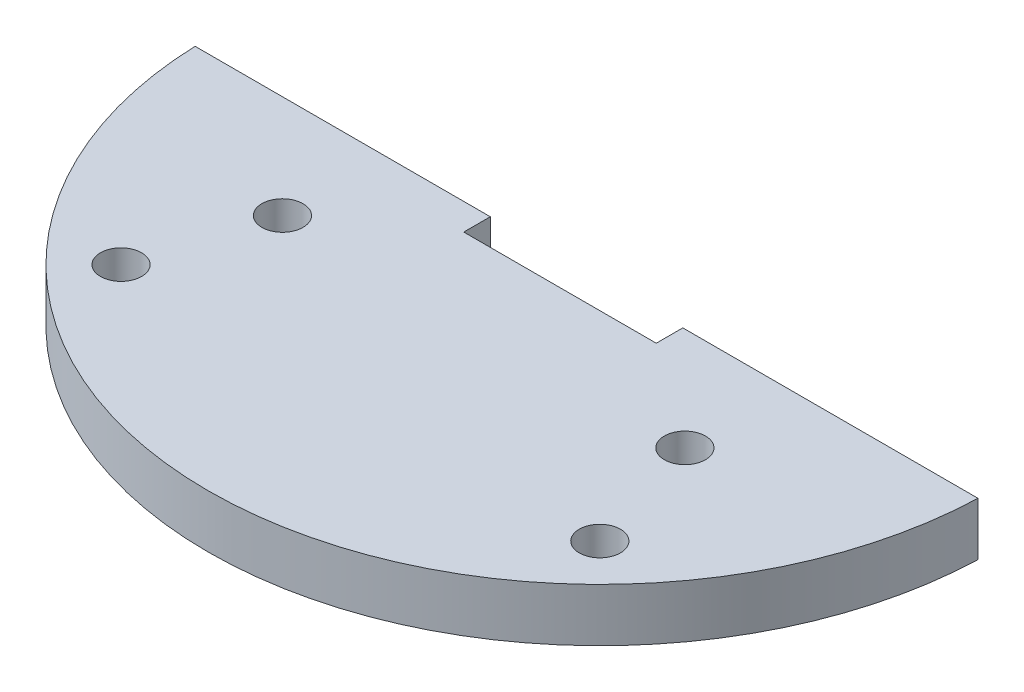
ISO-10303-21;
HEADER;
FILE_DESCRIPTION(('STEP AP214'),'2;1');
FILE_NAME('part.step','',(''),(''),'','','');
FILE_SCHEMA(('AUTOMOTIVE_DESIGN { 1 0 10303 214 1 1 1 1 }'));
ENDSEC;
DATA;
#1=APPLICATION_CONTEXT('core data for automotive mechanical design processes');
#2=APPLICATION_PROTOCOL_DEFINITION('international standard','automotive_design',2000,#1);
#3=PRODUCT_CONTEXT('',#1,'mechanical');
#4=PRODUCT('Part','Part','',(#3));
#5=PRODUCT_RELATED_PRODUCT_CATEGORY('part','',(#4));
#6=PRODUCT_DEFINITION_FORMATION('','',#4);
#7=PRODUCT_DEFINITION_CONTEXT('part definition',#1,'design');
#8=PRODUCT_DEFINITION('design','',#6,#7);
#9=PRODUCT_DEFINITION_SHAPE('','',#8);
#10=(LENGTH_UNIT() NAMED_UNIT(*) SI_UNIT(.MILLI.,.METRE.));
#11=(NAMED_UNIT(*) PLANE_ANGLE_UNIT() SI_UNIT($,.RADIAN.));
#12=(NAMED_UNIT(*) SI_UNIT($,.STERADIAN.) SOLID_ANGLE_UNIT());
#13=UNCERTAINTY_MEASURE_WITH_UNIT(LENGTH_MEASURE(1.E-05),#10,'distance_accuracy_value','');
#14=(GEOMETRIC_REPRESENTATION_CONTEXT(3) GLOBAL_UNCERTAINTY_ASSIGNED_CONTEXT((#13)) GLOBAL_UNIT_ASSIGNED_CONTEXT((#10,
#11,#12)) REPRESENTATION_CONTEXT('',''));
#15=CARTESIAN_POINT('',(0.,0.,0.));
#16=DIRECTION('',(0.,0.,1.));
#17=DIRECTION('',(1.,0.,0.));
#18=AXIS2_PLACEMENT_3D('',#15,#16,#17);
#19=CARTESIAN_POINT('',(-30.66172047433,-0.01,1.));
#20=DIRECTION('',(0.,0.,1.));
#21=DIRECTION('',(1.,0.,0.));
#22=AXIS2_PLACEMENT_3D('',#19,#20,#21);
#23=PLANE('',#22);
#24=DIRECTION('',(1.,0.,0.));
#25=VECTOR('',#24,1.);
#26=CARTESIAN_POINT('',(0.,4.,1.));
#27=LINE('',#26,#25);
#28=CARTESIAN_POINT('',(-29.4830459756111,4.,1.));
#29=VERTEX_POINT('',#28);
#30=CARTESIAN_POINT('',(-7.25,4.,1.));
#31=VERTEX_POINT('',#30);
#32=EDGE_CURVE('E150',#29,#31,#27,.T.);
#33=ORIENTED_EDGE('',*,*,#32,.T.);
#34=DIRECTION('',(0.,1.,0.));
#35=VECTOR('',#34,1.);
#36=CARTESIAN_POINT('',(-7.25,0.,1.));
#37=LINE('',#36,#35);
#38=CARTESIAN_POINT('',(-7.25,0.,1.));
#39=VERTEX_POINT('',#38);
#40=EDGE_CURVE('E128',#39,#31,#37,.T.);
#41=ORIENTED_EDGE('',*,*,#40,.F.);
#42=DIRECTION('',(1.,0.,0.));
#43=VECTOR('',#42,1.);
#44=CARTESIAN_POINT('',(0.,0.,1.));
#45=LINE('',#44,#43);
#46=CARTESIAN_POINT('',(-29.4830459756111,0.,1.));
#47=VERTEX_POINT('',#46);
#48=EDGE_CURVE('E114',#47,#39,#45,.T.);
#49=ORIENTED_EDGE('',*,*,#48,.F.);
#50=DIRECTION('',(0.,-1.,0.));
#51=VECTOR('',#50,1.);
#52=CARTESIAN_POINT('',(-29.4830459756111,4.,1.));
#53=LINE('',#52,#51);
#54=EDGE_CURVE('E40',#29,#47,#53,.T.);
#55=ORIENTED_EDGE('',*,*,#54,.F.);
#56=EDGE_LOOP('',(#33,#41,#49,#55));
#57=FACE_BOUND('',#56,.T.);
#58=ADVANCED_FACE('F37',(#57),#23,.F.);
#59=CARTESIAN_POINT('',(7.25,0.,1.));
#60=VERTEX_POINT('',#59);
#61=CARTESIAN_POINT('',(29.4830459756111,0.,1.));
#62=VERTEX_POINT('',#61);
#63=EDGE_CURVE('E146',#60,#62,#45,.T.);
#64=ORIENTED_EDGE('',*,*,#63,.F.);
#65=DIRECTION('',(0.,1.,0.));
#66=VECTOR('',#65,1.);
#67=CARTESIAN_POINT('',(7.25,0.,1.));
#68=LINE('',#67,#66);
#69=CARTESIAN_POINT('',(7.25,4.,1.));
#70=VERTEX_POINT('',#69);
#71=EDGE_CURVE('E11',#60,#70,#68,.T.);
#72=ORIENTED_EDGE('',*,*,#71,.T.);
#73=CARTESIAN_POINT('',(29.4830459756111,4.,1.));
#74=VERTEX_POINT('',#73);
#75=EDGE_CURVE('E45',#70,#74,#27,.T.);
#76=ORIENTED_EDGE('',*,*,#75,.T.);
#77=DIRECTION('',(0.,-1.,0.));
#78=VECTOR('',#77,1.);
#79=CARTESIAN_POINT('',(29.4830459756111,4.,1.));
#80=LINE('',#79,#78);
#81=EDGE_CURVE('E151',#62,#74,#80,.F.);
#82=ORIENTED_EDGE('',*,*,#81,.F.);
#83=EDGE_LOOP('',(#64,#72,#76,#82));
#84=FACE_BOUND('',#83,.T.);
#85=ADVANCED_FACE('F178',(#84),#23,.F.);
#86=CARTESIAN_POINT('',(18.031222920257,0.,18.0312229202569));
#87=DIRECTION('',(0.,1.,0.));
#88=DIRECTION('',(0.,0.,1.));
#89=AXIS2_PLACEMENT_3D('',#86,#87,#88);
#90=CYLINDRICAL_SURFACE('',#89,1.55);
#91=CARTESIAN_POINT('',(18.031222920257,0.,18.0312229202569));
#92=DIRECTION('',(0.,1.,0.));
#93=DIRECTION('',(0.,0.,-1.));
#94=AXIS2_PLACEMENT_3D('',#91,#92,#93);
#95=CIRCLE('',#94,1.55);
#96=CARTESIAN_POINT('',(18.031222920257,0.,16.4812229202569));
#97=VERTEX_POINT('',#96);
#98=EDGE_CURVE('E139',#97,#97,#95,.T.);
#99=ORIENTED_EDGE('',*,*,#98,.F.);
#100=EDGE_LOOP('',(#99));
#101=FACE_BOUND('',#100,.T.);
#102=CARTESIAN_POINT('',(18.031222920257,4.,18.0312229202569));
#103=DIRECTION('',(0.,1.,0.));
#104=DIRECTION('',(0.,0.,-1.));
#105=AXIS2_PLACEMENT_3D('',#102,#103,#104);
#106=CIRCLE('',#105,1.55);
#107=CARTESIAN_POINT('',(18.031222920257,4.,16.4812229202569));
#108=VERTEX_POINT('',#107);
#109=EDGE_CURVE('E129',#108,#108,#106,.T.);
#110=ORIENTED_EDGE('',*,*,#109,.T.);
#111=EDGE_LOOP('',(#110));
#112=FACE_BOUND('',#111,.T.);
#113=ADVANCED_FACE('F173',(#101,#112),#90,.F.);
#114=CARTESIAN_POINT('',(-18.0312229202569,0.,18.0312229202571));
#115=DIRECTION('',(0.,1.,0.));
#116=DIRECTION('',(0.,0.,1.));
#117=AXIS2_PLACEMENT_3D('',#114,#115,#116);
#118=CYLINDRICAL_SURFACE('',#117,1.55);
#119=CARTESIAN_POINT('',(-18.0312229202569,0.,18.0312229202571));
#120=DIRECTION('',(0.,1.,0.));
#121=DIRECTION('',(1.,0.,0.));
#122=AXIS2_PLACEMENT_3D('',#119,#120,#121);
#123=CIRCLE('',#122,1.55);
#124=CARTESIAN_POINT('',(-16.4812229202569,0.,18.0312229202571));
#125=VERTEX_POINT('',#124);
#126=EDGE_CURVE('E132',#125,#125,#123,.T.);
#127=ORIENTED_EDGE('',*,*,#126,.F.);
#128=EDGE_LOOP('',(#127));
#129=FACE_BOUND('',#128,.T.);
#130=CARTESIAN_POINT('',(-18.0312229202569,4.,18.0312229202571));
#131=DIRECTION('',(0.,1.,0.));
#132=DIRECTION('',(1.,0.,0.));
#133=AXIS2_PLACEMENT_3D('',#130,#131,#132);
#134=CIRCLE('',#133,1.55);
#135=CARTESIAN_POINT('',(-16.4812229202569,4.,18.0312229202571));
#136=VERTEX_POINT('',#135);
#137=EDGE_CURVE('E136',#136,#136,#134,.T.);
#138=ORIENTED_EDGE('',*,*,#137,.T.);
#139=EDGE_LOOP('',(#138));
#140=FACE_BOUND('',#139,.T.);
#141=ADVANCED_FACE('F165',(#129,#140),#118,.F.);
#142=CARTESIAN_POINT('',(0.,4.,0.));
#143=DIRECTION('',(0.,-1.,0.));
#144=DIRECTION('',(0.,0.,-1.));
#145=AXIS2_PLACEMENT_3D('',#142,#143,#144);
#146=CYLINDRICAL_SURFACE('',#145,29.5);
#147=CARTESIAN_POINT('',(0.,4.,0.));
#148=DIRECTION('',(0.,1.,0.));
#149=DIRECTION('',(0.,0.,1.));
#150=AXIS2_PLACEMENT_3D('',#147,#148,#149);
#151=CIRCLE('',#150,29.5);
#152=EDGE_CURVE('E144',#29,#74,#151,.T.);
#153=ORIENTED_EDGE('',*,*,#152,.F.);
#154=ORIENTED_EDGE('',*,*,#54,.T.);
#155=CARTESIAN_POINT('',(0.,0.,0.));
#156=DIRECTION('',(0.,1.,0.));
#157=DIRECTION('',(0.,0.,1.));
#158=AXIS2_PLACEMENT_3D('',#155,#156,#157);
#159=CIRCLE('',#158,29.5);
#160=EDGE_CURVE('E135',#47,#62,#159,.T.);
#161=ORIENTED_EDGE('',*,*,#160,.T.);
#162=ORIENTED_EDGE('',*,*,#81,.T.);
#163=EDGE_LOOP('',(#153,#154,#161,#162));
#164=FACE_BOUND('',#163,.T.);
#165=ADVANCED_FACE('F162',(#164),#146,.T.);
#166=CARTESIAN_POINT('',(15.1554445662278,0.,8.74999999999986));
#167=DIRECTION('',(0.,1.,0.));
#168=DIRECTION('',(0.,0.,1.));
#169=AXIS2_PLACEMENT_3D('',#166,#167,#168);
#170=CYLINDRICAL_SURFACE('',#169,1.55);
#171=CARTESIAN_POINT('',(15.1554445662278,0.,8.74999999999986));
#172=DIRECTION('',(0.,1.,0.));
#173=DIRECTION('',(-0.866025403784443,0.,-0.499999999999992));
#174=AXIS2_PLACEMENT_3D('',#171,#172,#173);
#175=CIRCLE('',#174,1.55);
#176=CARTESIAN_POINT('',(13.8131051903619,0.,7.97499999999987));
#177=VERTEX_POINT('',#176);
#178=EDGE_CURVE('E206',#177,#177,#175,.T.);
#179=ORIENTED_EDGE('',*,*,#178,.F.);
#180=EDGE_LOOP('',(#179));
#181=FACE_BOUND('',#180,.T.);
#182=CARTESIAN_POINT('',(15.1554445662278,4.,8.74999999999986));
#183=DIRECTION('',(0.,1.,0.));
#184=DIRECTION('',(-0.866025403784443,0.,-0.499999999999992));
#185=AXIS2_PLACEMENT_3D('',#182,#183,#184);
#186=CIRCLE('',#185,1.55);
#187=CARTESIAN_POINT('',(13.8131051903619,4.,7.97499999999987));
#188=VERTEX_POINT('',#187);
#189=EDGE_CURVE('E121',#188,#188,#186,.T.);
#190=ORIENTED_EDGE('',*,*,#189,.T.);
#191=EDGE_LOOP('',(#190));
#192=FACE_BOUND('',#191,.T.);
#193=ADVANCED_FACE('F164',(#181,#192),#170,.F.);
#194=CARTESIAN_POINT('',(-15.1554445662276,0.,8.75000000000007));
#195=DIRECTION('',(0.,1.,0.));
#196=DIRECTION('',(0.,0.,1.));
#197=AXIS2_PLACEMENT_3D('',#194,#195,#196);
#198=CYLINDRICAL_SURFACE('',#197,1.55);
#199=CARTESIAN_POINT('',(-15.1554445662276,0.,8.75000000000007));
#200=DIRECTION('',(0.,1.,0.));
#201=DIRECTION('',(0.866025403784436,0.,-0.500000000000004));
#202=AXIS2_PLACEMENT_3D('',#199,#200,#201);
#203=CIRCLE('',#202,1.55);
#204=CARTESIAN_POINT('',(-13.8131051903618,0.,7.97500000000007));
#205=VERTEX_POINT('',#204);
#206=EDGE_CURVE('E126',#205,#205,#203,.T.);
#207=ORIENTED_EDGE('',*,*,#206,.F.);
#208=EDGE_LOOP('',(#207));
#209=FACE_BOUND('',#208,.T.);
#210=CARTESIAN_POINT('',(-15.1554445662276,4.,8.75000000000007));
#211=DIRECTION('',(0.,1.,0.));
#212=DIRECTION('',(0.866025403784436,0.,-0.500000000000004));
#213=AXIS2_PLACEMENT_3D('',#210,#211,#212);
#214=CIRCLE('',#213,1.55);
#215=CARTESIAN_POINT('',(-13.8131051903618,4.,7.97500000000007));
#216=VERTEX_POINT('',#215);
#217=EDGE_CURVE('E207',#216,#216,#214,.T.);
#218=ORIENTED_EDGE('',*,*,#217,.T.);
#219=EDGE_LOOP('',(#218));
#220=FACE_BOUND('',#219,.T.);
#221=ADVANCED_FACE('F170',(#209,#220),#198,.F.);
#222=CARTESIAN_POINT('',(-7.25,0.,3.));
#223=DIRECTION('',(0.,0.,1.));
#224=DIRECTION('',(1.,0.,0.));
#225=AXIS2_PLACEMENT_3D('',#222,#223,#224);
#226=PLANE('',#225);
#227=DIRECTION('',(1.,0.,0.));
#228=VECTOR('',#227,1.);
#229=CARTESIAN_POINT('',(-7.25,4.,3.));
#230=LINE('',#229,#228);
#231=CARTESIAN_POINT('',(-7.25,4.,3.));
#232=VERTEX_POINT('',#231);
#233=CARTESIAN_POINT('',(7.25,4.,3.));
#234=VERTEX_POINT('',#233);
#235=EDGE_CURVE('E118',#232,#234,#230,.T.);
#236=ORIENTED_EDGE('',*,*,#235,.T.);
#237=DIRECTION('',(0.,1.,0.));
#238=VECTOR('',#237,1.);
#239=CARTESIAN_POINT('',(7.25,0.,3.));
#240=LINE('',#239,#238);
#241=CARTESIAN_POINT('',(7.25,0.,3.));
#242=VERTEX_POINT('',#241);
#243=EDGE_CURVE('E100',#242,#234,#240,.T.);
#244=ORIENTED_EDGE('',*,*,#243,.F.);
#245=DIRECTION('',(1.,0.,0.));
#246=VECTOR('',#245,1.);
#247=CARTESIAN_POINT('',(-7.25,0.,3.));
#248=LINE('',#247,#246);
#249=CARTESIAN_POINT('',(-7.25,0.,3.));
#250=VERTEX_POINT('',#249);
#251=EDGE_CURVE('E105',#250,#242,#248,.T.);
#252=ORIENTED_EDGE('',*,*,#251,.F.);
#253=DIRECTION('',(0.,1.,0.));
#254=VECTOR('',#253,1.);
#255=CARTESIAN_POINT('',(-7.25,0.,3.));
#256=LINE('',#255,#254);
#257=EDGE_CURVE('E90',#250,#232,#256,.T.);
#258=ORIENTED_EDGE('',*,*,#257,.T.);
#259=EDGE_LOOP('',(#236,#244,#252,#258));
#260=FACE_BOUND('',#259,.T.);
#261=ADVANCED_FACE('F106',(#260),#226,.F.);
#262=CARTESIAN_POINT('',(0.,0.,0.));
#263=DIRECTION('',(0.,1.,0.));
#264=DIRECTION('',(0.,0.,1.));
#265=AXIS2_PLACEMENT_3D('',#262,#263,#264);
#266=PLANE('',#265);
#267=ORIENTED_EDGE('',*,*,#206,.T.);
#268=EDGE_LOOP('',(#267));
#269=FACE_BOUND('',#268,.T.);
#270=ORIENTED_EDGE('',*,*,#178,.T.);
#271=EDGE_LOOP('',(#270));
#272=FACE_BOUND('',#271,.T.);
#273=ORIENTED_EDGE('',*,*,#160,.F.);
#274=ORIENTED_EDGE('',*,*,#48,.T.);
#275=DIRECTION('',(0.,0.,1.));
#276=VECTOR('',#275,1.);
#277=CARTESIAN_POINT('',(-7.25,0.,1.));
#278=LINE('',#277,#276);
#279=EDGE_CURVE('E94',#39,#250,#278,.T.);
#280=ORIENTED_EDGE('',*,*,#279,.T.);
#281=ORIENTED_EDGE('',*,*,#251,.T.);
#282=DIRECTION('',(0.,0.,-1.));
#283=VECTOR('',#282,1.);
#284=CARTESIAN_POINT('',(7.25,0.,1.));
#285=LINE('',#284,#283);
#286=EDGE_CURVE('E101',#242,#60,#285,.T.);
#287=ORIENTED_EDGE('',*,*,#286,.T.);
#288=ORIENTED_EDGE('',*,*,#63,.T.);
#289=EDGE_LOOP('',(#273,#274,#280,#281,#287,#288));
#290=FACE_BOUND('',#289,.T.);
#291=ORIENTED_EDGE('',*,*,#126,.T.);
#292=EDGE_LOOP('',(#291));
#293=FACE_BOUND('',#292,.T.);
#294=ORIENTED_EDGE('',*,*,#98,.T.);
#295=EDGE_LOOP('',(#294));
#296=FACE_BOUND('',#295,.T.);
#297=ADVANCED_FACE('F111',(#269,#272,#290,#293,#296),#266,.F.);
#298=CARTESIAN_POINT('',(0.,4.,0.));
#299=DIRECTION('',(0.,1.,0.));
#300=DIRECTION('',(0.,0.,1.));
#301=AXIS2_PLACEMENT_3D('',#298,#299,#300);
#302=PLANE('',#301);
#303=ORIENTED_EDGE('',*,*,#32,.F.);
#304=ORIENTED_EDGE('',*,*,#152,.T.);
#305=ORIENTED_EDGE('',*,*,#75,.F.);
#306=DIRECTION('',(0.,0.,-1.));
#307=VECTOR('',#306,1.);
#308=CARTESIAN_POINT('',(7.25,4.,1.));
#309=LINE('',#308,#307);
#310=EDGE_CURVE('E116',#234,#70,#309,.T.);
#311=ORIENTED_EDGE('',*,*,#310,.F.);
#312=ORIENTED_EDGE('',*,*,#235,.F.);
#313=DIRECTION('',(0.,0.,1.));
#314=VECTOR('',#313,1.);
#315=CARTESIAN_POINT('',(-7.25,4.,1.));
#316=LINE('',#315,#314);
#317=EDGE_CURVE('E96',#31,#232,#316,.T.);
#318=ORIENTED_EDGE('',*,*,#317,.F.);
#319=EDGE_LOOP('',(#303,#304,#305,#311,#312,#318));
#320=FACE_BOUND('',#319,.T.);
#321=ORIENTED_EDGE('',*,*,#217,.F.);
#322=EDGE_LOOP('',(#321));
#323=FACE_BOUND('',#322,.T.);
#324=ORIENTED_EDGE('',*,*,#189,.F.);
#325=EDGE_LOOP('',(#324));
#326=FACE_BOUND('',#325,.T.);
#327=ORIENTED_EDGE('',*,*,#137,.F.);
#328=EDGE_LOOP('',(#327));
#329=FACE_BOUND('',#328,.T.);
#330=ORIENTED_EDGE('',*,*,#109,.F.);
#331=EDGE_LOOP('',(#330));
#332=FACE_BOUND('',#331,.T.);
#333=ADVANCED_FACE('F157',(#320,#323,#326,#329,#332),#302,.T.);
#334=CARTESIAN_POINT('',(7.25,0.,1.));
#335=DIRECTION('',(1.,0.,0.));
#336=DIRECTION('',(0.,0.,-1.));
#337=AXIS2_PLACEMENT_3D('',#334,#335,#336);
#338=PLANE('',#337);
#339=ORIENTED_EDGE('',*,*,#310,.T.);
#340=ORIENTED_EDGE('',*,*,#71,.F.);
#341=ORIENTED_EDGE('',*,*,#286,.F.);
#342=ORIENTED_EDGE('',*,*,#243,.T.);
#343=EDGE_LOOP('',(#339,#340,#341,#342));
#344=FACE_BOUND('',#343,.T.);
#345=ADVANCED_FACE('F159',(#344),#338,.F.);
#346=CARTESIAN_POINT('',(-7.25,0.,1.));
#347=DIRECTION('',(-1.,0.,0.));
#348=DIRECTION('',(0.,0.,1.));
#349=AXIS2_PLACEMENT_3D('',#346,#347,#348);
#350=PLANE('',#349);
#351=ORIENTED_EDGE('',*,*,#317,.T.);
#352=ORIENTED_EDGE('',*,*,#257,.F.);
#353=ORIENTED_EDGE('',*,*,#279,.F.);
#354=ORIENTED_EDGE('',*,*,#40,.T.);
#355=EDGE_LOOP('',(#351,#352,#353,#354));
#356=FACE_BOUND('',#355,.T.);
#357=ADVANCED_FACE('F92',(#356),#350,.F.);
#358=CLOSED_SHELL('',(#58,#85,#113,#141,#165,#193,#221,#261,#297,#333,#345,#357));
#359=MANIFOLD_SOLID_BREP('B2',#358);
#360=ADVANCED_BREP_SHAPE_REPRESENTATION('',(#18,#359),#14);
#361=SHAPE_DEFINITION_REPRESENTATION(#9,#360);
ENDSEC;
END-ISO-10303-21;
